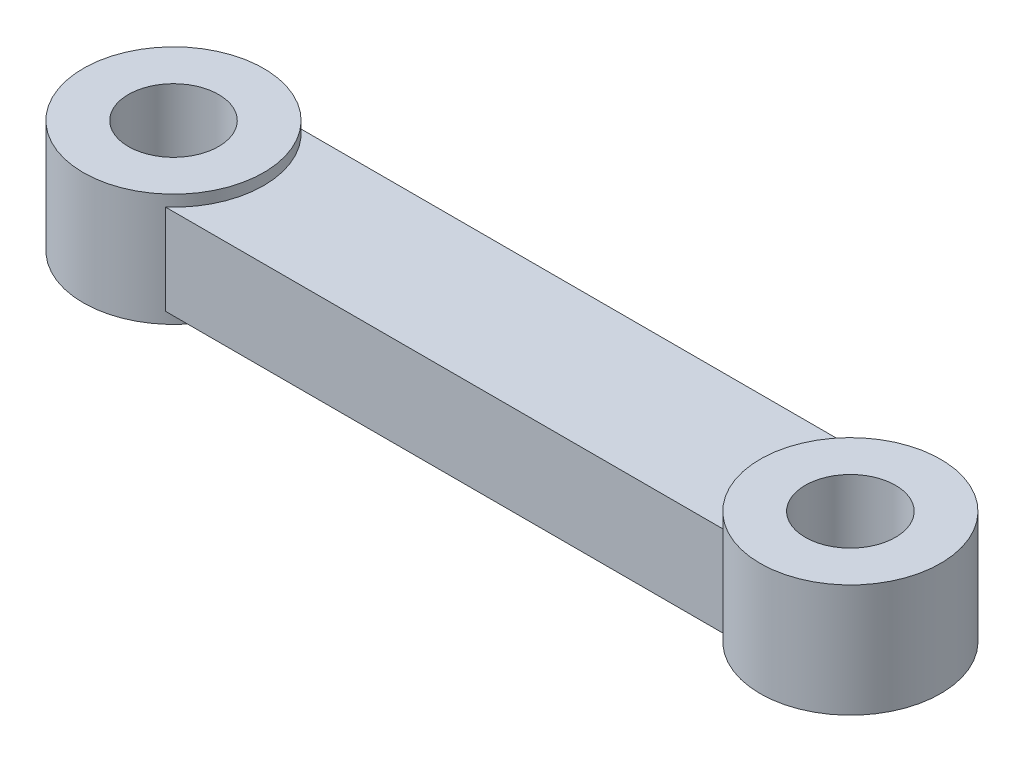
ISO-10303-21;
HEADER;
FILE_DESCRIPTION(('STEP AP214'),'2;1');
FILE_NAME('part.step','',(''),(''),'','','');
FILE_SCHEMA(('AUTOMOTIVE_DESIGN { 1 0 10303 214 1 1 1 1 }'));
ENDSEC;
DATA;
#1=APPLICATION_CONTEXT('core data for automotive mechanical design processes');
#2=APPLICATION_PROTOCOL_DEFINITION('international standard','automotive_design',2000,#1);
#3=PRODUCT_CONTEXT('',#1,'mechanical');
#4=PRODUCT('Part','Part','',(#3));
#5=PRODUCT_RELATED_PRODUCT_CATEGORY('part','',(#4));
#6=PRODUCT_DEFINITION_FORMATION('','',#4);
#7=PRODUCT_DEFINITION_CONTEXT('part definition',#1,'design');
#8=PRODUCT_DEFINITION('design','',#6,#7);
#9=PRODUCT_DEFINITION_SHAPE('','',#8);
#10=(LENGTH_UNIT() NAMED_UNIT(*) SI_UNIT(.MILLI.,.METRE.));
#11=(NAMED_UNIT(*) PLANE_ANGLE_UNIT() SI_UNIT($,.RADIAN.));
#12=(NAMED_UNIT(*) SI_UNIT($,.STERADIAN.) SOLID_ANGLE_UNIT());
#13=UNCERTAINTY_MEASURE_WITH_UNIT(LENGTH_MEASURE(1.E-05),#10,'distance_accuracy_value','');
#14=(GEOMETRIC_REPRESENTATION_CONTEXT(3) GLOBAL_UNCERTAINTY_ASSIGNED_CONTEXT((#13)) GLOBAL_UNIT_ASSIGNED_CONTEXT((#10,
#11,#12)) REPRESENTATION_CONTEXT('',''));
#15=CARTESIAN_POINT('',(0.,0.,0.));
#16=DIRECTION('',(0.,0.,1.));
#17=DIRECTION('',(1.,0.,0.));
#18=AXIS2_PLACEMENT_3D('',#15,#16,#17);
#19=CARTESIAN_POINT('',(0.,10.,0.));
#20=DIRECTION('',(0.,1.,0.));
#21=DIRECTION('',(0.,0.,1.));
#22=AXIS2_PLACEMENT_3D('',#19,#20,#21);
#23=PLANE('',#22);
#24=CARTESIAN_POINT('',(0.,10.,0.));
#25=DIRECTION('',(0.,1.,0.));
#26=DIRECTION('',(0.,0.,1.));
#27=AXIS2_PLACEMENT_3D('',#24,#25,#26);
#28=CIRCLE('',#27,8.);
#29=CARTESIAN_POINT('',(0.,10.,8.));
#30=VERTEX_POINT('',#29);
#31=EDGE_CURVE('E11',#30,#30,#28,.T.);
#32=ORIENTED_EDGE('',*,*,#31,.T.);
#33=EDGE_LOOP('',(#32));
#34=FACE_BOUND('',#33,.T.);
#35=CARTESIAN_POINT('',(0.,10.,0.));
#36=DIRECTION('',(0.,1.,0.));
#37=DIRECTION('',(0.,0.,1.));
#38=AXIS2_PLACEMENT_3D('',#35,#36,#37);
#39=CIRCLE('',#38,4.);
#40=CARTESIAN_POINT('',(0.,10.,4.));
#41=VERTEX_POINT('',#40);
#42=EDGE_CURVE('E116',#41,#41,#39,.T.);
#43=ORIENTED_EDGE('',*,*,#42,.F.);
#44=EDGE_LOOP('',(#43));
#45=FACE_BOUND('',#44,.T.);
#46=ADVANCED_FACE('F35',(#34,#45),#23,.T.);
#47=CARTESIAN_POINT('',(0.,0.,0.));
#48=DIRECTION('',(0.,1.,0.));
#49=DIRECTION('',(0.,0.,1.));
#50=AXIS2_PLACEMENT_3D('',#47,#48,#49);
#51=PLANE('',#50);
#52=CARTESIAN_POINT('',(0.,0.,0.));
#53=DIRECTION('',(0.,1.,0.));
#54=DIRECTION('',(0.,0.,1.));
#55=AXIS2_PLACEMENT_3D('',#52,#53,#54);
#56=CIRCLE('',#55,8.);
#57=CARTESIAN_POINT('',(0.,0.,8.));
#58=VERTEX_POINT('',#57);
#59=EDGE_CURVE('E39',#58,#58,#56,.T.);
#60=ORIENTED_EDGE('',*,*,#59,.F.);
#61=EDGE_LOOP('',(#60));
#62=FACE_BOUND('',#61,.T.);
#63=CARTESIAN_POINT('',(0.,0.,0.));
#64=DIRECTION('',(0.,1.,0.));
#65=DIRECTION('',(0.,0.,1.));
#66=AXIS2_PLACEMENT_3D('',#63,#64,#65);
#67=CIRCLE('',#66,4.);
#68=CARTESIAN_POINT('',(0.,0.,4.));
#69=VERTEX_POINT('',#68);
#70=EDGE_CURVE('E85',#69,#69,#67,.T.);
#71=ORIENTED_EDGE('',*,*,#70,.T.);
#72=EDGE_LOOP('',(#71));
#73=FACE_BOUND('',#72,.T.);
#74=ADVANCED_FACE('F122',(#62,#73),#51,.F.);
#75=CARTESIAN_POINT('',(0.,10.,0.));
#76=DIRECTION('',(0.,-1.,0.));
#77=DIRECTION('',(0.,0.,-1.));
#78=AXIS2_PLACEMENT_3D('',#75,#76,#77);
#79=CYLINDRICAL_SURFACE('',#78,8.);
#80=DIRECTION('',(0.,-1.,0.));
#81=VECTOR('',#80,1.);
#82=CARTESIAN_POINT('',(5.29150262212918,9.,6.));
#83=LINE('',#82,#81);
#84=CARTESIAN_POINT('',(5.29150262212918,9.,6.));
#85=VERTEX_POINT('',#84);
#86=CARTESIAN_POINT('',(5.29150262212918,0.999999999999999,6.));
#87=VERTEX_POINT('',#86);
#88=EDGE_CURVE('E55',#85,#87,#83,.T.);
#89=ORIENTED_EDGE('',*,*,#88,.F.);
#90=CARTESIAN_POINT('',(0.,9.,0.));
#91=DIRECTION('',(0.,-1.,0.));
#92=DIRECTION('',(0.,0.,1.));
#93=AXIS2_PLACEMENT_3D('',#90,#91,#92);
#94=CIRCLE('',#93,8.);
#95=CARTESIAN_POINT('',(5.29150262212918,9.,-6.));
#96=VERTEX_POINT('',#95);
#97=EDGE_CURVE('E50',#96,#85,#94,.T.);
#98=ORIENTED_EDGE('',*,*,#97,.F.);
#99=DIRECTION('',(0.,-1.,0.));
#100=VECTOR('',#99,1.);
#101=CARTESIAN_POINT('',(5.29150262212918,9.,-6.));
#102=LINE('',#101,#100);
#103=CARTESIAN_POINT('',(5.29150262212918,1.,-6.));
#104=VERTEX_POINT('',#103);
#105=EDGE_CURVE('E86',#96,#104,#102,.T.);
#106=ORIENTED_EDGE('',*,*,#105,.T.);
#107=CARTESIAN_POINT('',(0.,1.,0.));
#108=DIRECTION('',(0.,-1.,0.));
#109=DIRECTION('',(0.,0.,1.));
#110=AXIS2_PLACEMENT_3D('',#107,#108,#109);
#111=CIRCLE('',#110,8.);
#112=EDGE_CURVE('E94',#104,#87,#111,.T.);
#113=ORIENTED_EDGE('',*,*,#112,.T.);
#114=EDGE_LOOP('',(#89,#98,#106,#113));
#115=FACE_BOUND('',#114,.T.);
#116=ORIENTED_EDGE('',*,*,#31,.F.);
#117=EDGE_LOOP('',(#116));
#118=FACE_BOUND('',#117,.T.);
#119=ORIENTED_EDGE('',*,*,#59,.T.);
#120=EDGE_LOOP('',(#119));
#121=FACE_BOUND('',#120,.T.);
#122=ADVANCED_FACE('F37',(#115,#118,#121),#79,.T.);
#123=CARTESIAN_POINT('',(0.,10.,0.));
#124=DIRECTION('',(0.,-1.,0.));
#125=DIRECTION('',(0.,0.,-1.));
#126=AXIS2_PLACEMENT_3D('',#123,#124,#125);
#127=CYLINDRICAL_SURFACE('',#126,4.);
#128=ORIENTED_EDGE('',*,*,#42,.T.);
#129=EDGE_LOOP('',(#128));
#130=FACE_BOUND('',#129,.T.);
#131=ORIENTED_EDGE('',*,*,#70,.F.);
#132=EDGE_LOOP('',(#131));
#133=FACE_BOUND('',#132,.T.);
#134=ADVANCED_FACE('F124',(#130,#133),#127,.F.);
#135=CARTESIAN_POINT('',(5.29150262212918,9.,-6.));
#136=DIRECTION('',(0.,0.,1.));
#137=DIRECTION('',(1.,0.,0.));
#138=AXIS2_PLACEMENT_3D('',#135,#136,#137);
#139=PLANE('',#138);
#140=DIRECTION('',(-1.,0.,0.));
#141=VECTOR('',#140,1.);
#142=CARTESIAN_POINT('',(5.29150262212918,1.,-6.));
#143=LINE('',#142,#141);
#144=CARTESIAN_POINT('',(54.7084973778708,0.999999999999999,-6.));
#145=VERTEX_POINT('',#144);
#146=EDGE_CURVE('E78',#145,#104,#143,.T.);
#147=ORIENTED_EDGE('',*,*,#146,.T.);
#148=ORIENTED_EDGE('',*,*,#105,.F.);
#149=DIRECTION('',(-1.,0.,0.));
#150=VECTOR('',#149,1.);
#151=CARTESIAN_POINT('',(5.29150262212918,9.,-6.));
#152=LINE('',#151,#150);
#153=CARTESIAN_POINT('',(54.7084973778708,9.,-6.));
#154=VERTEX_POINT('',#153);
#155=EDGE_CURVE('E80',#154,#96,#152,.T.);
#156=ORIENTED_EDGE('',*,*,#155,.F.);
#157=DIRECTION('',(0.,-1.,0.));
#158=VECTOR('',#157,1.);
#159=CARTESIAN_POINT('',(54.7084973778708,9.,-6.));
#160=LINE('',#159,#158);
#161=EDGE_CURVE('E74',#154,#145,#160,.T.);
#162=ORIENTED_EDGE('',*,*,#161,.T.);
#163=EDGE_LOOP('',(#147,#148,#156,#162));
#164=FACE_BOUND('',#163,.T.);
#165=ADVANCED_FACE('F76',(#164),#139,.F.);
#166=CARTESIAN_POINT('',(5.29150262212918,9.,6.));
#167=DIRECTION('',(0.,0.,-1.));
#168=DIRECTION('',(-1.,0.,0.));
#169=AXIS2_PLACEMENT_3D('',#166,#167,#168);
#170=PLANE('',#169);
#171=DIRECTION('',(1.,0.,0.));
#172=VECTOR('',#171,1.);
#173=CARTESIAN_POINT('',(5.29150262212918,1.,6.));
#174=LINE('',#173,#172);
#175=CARTESIAN_POINT('',(54.7084973778708,1.,6.));
#176=VERTEX_POINT('',#175);
#177=EDGE_CURVE('E110',#87,#176,#174,.T.);
#178=ORIENTED_EDGE('',*,*,#177,.T.);
#179=DIRECTION('',(0.,-1.,0.));
#180=VECTOR('',#179,1.);
#181=CARTESIAN_POINT('',(54.7084973778708,9.,6.));
#182=LINE('',#181,#180);
#183=CARTESIAN_POINT('',(54.7084973778708,9.,6.));
#184=VERTEX_POINT('',#183);
#185=EDGE_CURVE('E99',#184,#176,#182,.T.);
#186=ORIENTED_EDGE('',*,*,#185,.F.);
#187=DIRECTION('',(1.,0.,0.));
#188=VECTOR('',#187,1.);
#189=CARTESIAN_POINT('',(5.29150262212918,9.,6.));
#190=LINE('',#189,#188);
#191=EDGE_CURVE('E106',#85,#184,#190,.T.);
#192=ORIENTED_EDGE('',*,*,#191,.F.);
#193=ORIENTED_EDGE('',*,*,#88,.T.);
#194=EDGE_LOOP('',(#178,#186,#192,#193));
#195=FACE_BOUND('',#194,.T.);
#196=ADVANCED_FACE('F132',(#195),#170,.F.);
#197=CARTESIAN_POINT('',(60.,9.,0.));
#198=DIRECTION('',(0.,1.,0.));
#199=DIRECTION('',(0.,0.,1.));
#200=AXIS2_PLACEMENT_3D('',#197,#198,#199);
#201=PLANE('',#200);
#202=CARTESIAN_POINT('',(60.,9.,0.));
#203=DIRECTION('',(0.,-1.,0.));
#204=DIRECTION('',(0.,0.,1.));
#205=AXIS2_PLACEMENT_3D('',#202,#203,#204);
#206=CIRCLE('',#205,8.);
#207=EDGE_CURVE('E112',#184,#154,#206,.T.);
#208=ORIENTED_EDGE('',*,*,#207,.T.);
#209=ORIENTED_EDGE('',*,*,#155,.T.);
#210=ORIENTED_EDGE('',*,*,#97,.T.);
#211=ORIENTED_EDGE('',*,*,#191,.T.);
#212=EDGE_LOOP('',(#208,#209,#210,#211));
#213=FACE_BOUND('',#212,.T.);
#214=ADVANCED_FACE('F172',(#213),#201,.T.);
#215=CARTESIAN_POINT('',(60.,1.,0.));
#216=DIRECTION('',(0.,1.,0.));
#217=DIRECTION('',(0.,0.,1.));
#218=AXIS2_PLACEMENT_3D('',#215,#216,#217);
#219=PLANE('',#218);
#220=CARTESIAN_POINT('',(60.,1.,0.));
#221=DIRECTION('',(0.,-1.,0.));
#222=DIRECTION('',(0.,0.,1.));
#223=AXIS2_PLACEMENT_3D('',#220,#221,#222);
#224=CIRCLE('',#223,8.);
#225=EDGE_CURVE('E92',#176,#145,#224,.T.);
#226=ORIENTED_EDGE('',*,*,#225,.F.);
#227=ORIENTED_EDGE('',*,*,#177,.F.);
#228=ORIENTED_EDGE('',*,*,#112,.F.);
#229=ORIENTED_EDGE('',*,*,#146,.F.);
#230=EDGE_LOOP('',(#226,#227,#228,#229));
#231=FACE_BOUND('',#230,.T.);
#232=ADVANCED_FACE('F90',(#231),#219,.F.);
#233=CARTESIAN_POINT('',(60.,10.,0.));
#234=DIRECTION('',(0.,1.,0.));
#235=DIRECTION('',(0.,0.,1.));
#236=AXIS2_PLACEMENT_3D('',#233,#234,#235);
#237=PLANE('',#236);
#238=CARTESIAN_POINT('',(60.,10.,0.));
#239=DIRECTION('',(0.,1.,0.));
#240=DIRECTION('',(0.,0.,1.));
#241=AXIS2_PLACEMENT_3D('',#238,#239,#240);
#242=CIRCLE('',#241,8.);
#243=CARTESIAN_POINT('',(60.,10.,8.));
#244=VERTEX_POINT('',#243);
#245=EDGE_CURVE('E100',#244,#244,#242,.T.);
#246=ORIENTED_EDGE('',*,*,#245,.T.);
#247=EDGE_LOOP('',(#246));
#248=FACE_BOUND('',#247,.T.);
#249=CARTESIAN_POINT('',(60.,10.,0.));
#250=DIRECTION('',(0.,1.,0.));
#251=DIRECTION('',(0.,0.,1.));
#252=AXIS2_PLACEMENT_3D('',#249,#250,#251);
#253=CIRCLE('',#252,4.00000000000001);
#254=CARTESIAN_POINT('',(60.,10.,4.00000000000001));
#255=VERTEX_POINT('',#254);
#256=EDGE_CURVE('E234',#255,#255,#253,.T.);
#257=ORIENTED_EDGE('',*,*,#256,.F.);
#258=EDGE_LOOP('',(#257));
#259=FACE_BOUND('',#258,.T.);
#260=ADVANCED_FACE('F191',(#248,#259),#237,.T.);
#261=CARTESIAN_POINT('',(60.,0.,0.));
#262=DIRECTION('',(0.,1.,0.));
#263=DIRECTION('',(0.,0.,1.));
#264=AXIS2_PLACEMENT_3D('',#261,#262,#263);
#265=PLANE('',#264);
#266=CARTESIAN_POINT('',(60.,0.,0.));
#267=DIRECTION('',(0.,1.,0.));
#268=DIRECTION('',(0.,0.,1.));
#269=AXIS2_PLACEMENT_3D('',#266,#267,#268);
#270=CIRCLE('',#269,8.);
#271=CARTESIAN_POINT('',(60.,0.,8.));
#272=VERTEX_POINT('',#271);
#273=EDGE_CURVE('E103',#272,#272,#270,.T.);
#274=ORIENTED_EDGE('',*,*,#273,.F.);
#275=EDGE_LOOP('',(#274));
#276=FACE_BOUND('',#275,.T.);
#277=CARTESIAN_POINT('',(60.,0.,0.));
#278=DIRECTION('',(0.,1.,0.));
#279=DIRECTION('',(0.,0.,1.));
#280=AXIS2_PLACEMENT_3D('',#277,#278,#279);
#281=CIRCLE('',#280,4.00000000000001);
#282=CARTESIAN_POINT('',(60.,0.,4.00000000000001));
#283=VERTEX_POINT('',#282);
#284=EDGE_CURVE('E237',#283,#283,#281,.T.);
#285=ORIENTED_EDGE('',*,*,#284,.T.);
#286=EDGE_LOOP('',(#285));
#287=FACE_BOUND('',#286,.T.);
#288=ADVANCED_FACE('F200',(#276,#287),#265,.F.);
#289=CARTESIAN_POINT('',(60.,10.,0.));
#290=DIRECTION('',(0.,-1.,0.));
#291=DIRECTION('',(0.,0.,-1.));
#292=AXIS2_PLACEMENT_3D('',#289,#290,#291);
#293=CYLINDRICAL_SURFACE('',#292,8.);
#294=ORIENTED_EDGE('',*,*,#207,.F.);
#295=ORIENTED_EDGE('',*,*,#185,.T.);
#296=ORIENTED_EDGE('',*,*,#225,.T.);
#297=ORIENTED_EDGE('',*,*,#161,.F.);
#298=EDGE_LOOP('',(#294,#295,#296,#297));
#299=FACE_BOUND('',#298,.T.);
#300=ORIENTED_EDGE('',*,*,#245,.F.);
#301=EDGE_LOOP('',(#300));
#302=FACE_BOUND('',#301,.T.);
#303=ORIENTED_EDGE('',*,*,#273,.T.);
#304=EDGE_LOOP('',(#303));
#305=FACE_BOUND('',#304,.T.);
#306=ADVANCED_FACE('F96',(#299,#302,#305),#293,.T.);
#307=CARTESIAN_POINT('',(60.,10.,0.));
#308=DIRECTION('',(0.,-1.,0.));
#309=DIRECTION('',(0.,0.,-1.));
#310=AXIS2_PLACEMENT_3D('',#307,#308,#309);
#311=CYLINDRICAL_SURFACE('',#310,4.00000000000001);
#312=ORIENTED_EDGE('',*,*,#256,.T.);
#313=EDGE_LOOP('',(#312));
#314=FACE_BOUND('',#313,.T.);
#315=ORIENTED_EDGE('',*,*,#284,.F.);
#316=EDGE_LOOP('',(#315));
#317=FACE_BOUND('',#316,.T.);
#318=ADVANCED_FACE('F219',(#314,#317),#311,.F.);
#319=CLOSED_SHELL('',(#46,#74,#122,#134,#165,#196,#214,#232,#260,#288,#306,#318));
#320=MANIFOLD_SOLID_BREP('B2',#319);
#321=ADVANCED_BREP_SHAPE_REPRESENTATION('',(#18,#320),#14);
#322=SHAPE_DEFINITION_REPRESENTATION(#9,#321);
ENDSEC;
END-ISO-10303-21;
